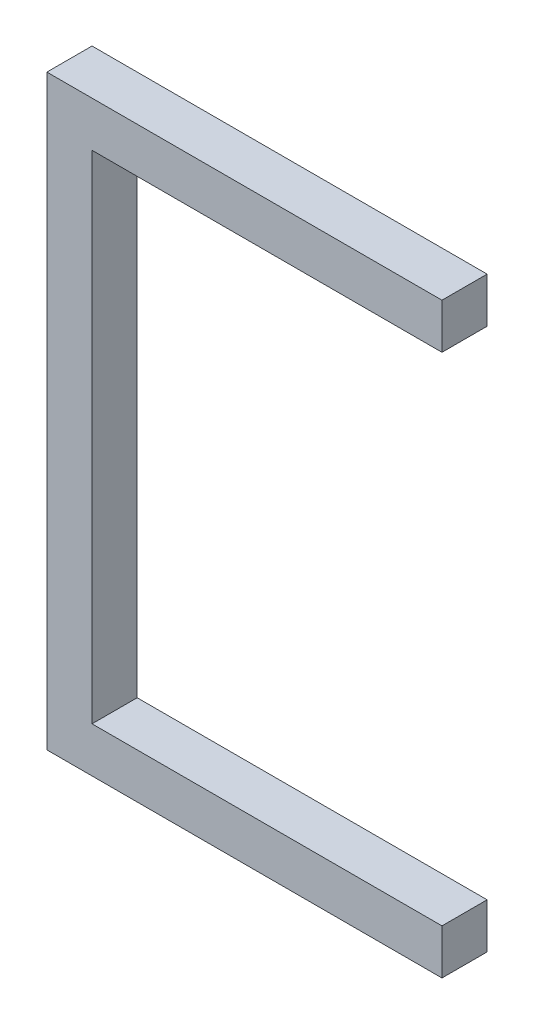
ISO-10303-21;
HEADER;
FILE_DESCRIPTION(('STEP AP214'),'2;1');
FILE_NAME('part.step','',(''),(''),'','','');
FILE_SCHEMA(('AUTOMOTIVE_DESIGN { 1 0 10303 214 1 1 1 1 }'));
ENDSEC;
DATA;
#1=APPLICATION_CONTEXT('core data for automotive mechanical design processes');
#2=APPLICATION_PROTOCOL_DEFINITION('international standard','automotive_design',2000,#1);
#3=PRODUCT_CONTEXT('',#1,'mechanical');
#4=PRODUCT('Part','Part','',(#3));
#5=PRODUCT_RELATED_PRODUCT_CATEGORY('part','',(#4));
#6=PRODUCT_DEFINITION_FORMATION('','',#4);
#7=PRODUCT_DEFINITION_CONTEXT('part definition',#1,'design');
#8=PRODUCT_DEFINITION('design','',#6,#7);
#9=PRODUCT_DEFINITION_SHAPE('','',#8);
#10=(LENGTH_UNIT() NAMED_UNIT(*) SI_UNIT(.MILLI.,.METRE.));
#11=(NAMED_UNIT(*) PLANE_ANGLE_UNIT() SI_UNIT($,.RADIAN.));
#12=(NAMED_UNIT(*) SI_UNIT($,.STERADIAN.) SOLID_ANGLE_UNIT());
#13=UNCERTAINTY_MEASURE_WITH_UNIT(LENGTH_MEASURE(1.E-05),#10,'distance_accuracy_value','');
#14=(GEOMETRIC_REPRESENTATION_CONTEXT(3) GLOBAL_UNCERTAINTY_ASSIGNED_CONTEXT((#13)) GLOBAL_UNIT_ASSIGNED_CONTEXT((#10,
#11,#12)) REPRESENTATION_CONTEXT('',''));
#15=CARTESIAN_POINT('',(0.,0.,0.));
#16=DIRECTION('',(0.,0.,1.));
#17=DIRECTION('',(1.,0.,0.));
#18=AXIS2_PLACEMENT_3D('',#15,#16,#17);
#19=CARTESIAN_POINT('',(18.0515620095641,363.949873220831,25.4));
#20=DIRECTION('',(-1.,0.,0.));
#21=DIRECTION('',(0.,-1.,0.));
#22=AXIS2_PLACEMENT_3D('',#19,#20,#21);
#23=PLANE('',#22);
#24=DIRECTION('',(0.,1.,0.));
#25=VECTOR('',#24,1.);
#26=CARTESIAN_POINT('',(18.0515620095641,363.949873220831,0.));
#27=LINE('',#26,#25);
#28=CARTESIAN_POINT('',(18.0515620095641,338.549873220831,0.));
#29=VERTEX_POINT('',#28);
#30=CARTESIAN_POINT('',(18.0515620095641,363.949873220831,0.));
#31=VERTEX_POINT('',#30);
#32=EDGE_CURVE('E129',#29,#31,#27,.T.);
#33=ORIENTED_EDGE('',*,*,#32,.T.);
#34=DIRECTION('',(0.,0.,-1.));
#35=VECTOR('',#34,1.);
#36=CARTESIAN_POINT('',(18.0515620095641,363.949873220831,25.4));
#37=LINE('',#36,#35);
#38=CARTESIAN_POINT('',(18.0515620095641,363.949873220831,25.4));
#39=VERTEX_POINT('',#38);
#40=EDGE_CURVE('E11',#39,#31,#37,.T.);
#41=ORIENTED_EDGE('',*,*,#40,.F.);
#42=DIRECTION('',(0.,1.,0.));
#43=VECTOR('',#42,1.);
#44=CARTESIAN_POINT('',(18.0515620095641,363.949873220831,25.4));
#45=LINE('',#44,#43);
#46=CARTESIAN_POINT('',(18.0515620095641,338.549873220831,25.4));
#47=VERTEX_POINT('',#46);
#48=EDGE_CURVE('E143',#47,#39,#45,.T.);
#49=ORIENTED_EDGE('',*,*,#48,.F.);
#50=DIRECTION('',(0.,0.,-1.));
#51=VECTOR('',#50,1.);
#52=CARTESIAN_POINT('',(18.0515620095641,338.549873220831,25.4));
#53=LINE('',#52,#51);
#54=EDGE_CURVE('E125',#47,#29,#53,.T.);
#55=ORIENTED_EDGE('',*,*,#54,.T.);
#56=EDGE_LOOP('',(#33,#41,#49,#55));
#57=FACE_BOUND('',#56,.T.);
#58=ADVANCED_FACE('F33',(#57),#23,.F.);
#59=CARTESIAN_POINT('',(-178.798437990436,363.949873220831,25.4));
#60=DIRECTION('',(0.,-1.,0.));
#61=DIRECTION('',(1.,0.,0.));
#62=AXIS2_PLACEMENT_3D('',#59,#60,#61);
#63=PLANE('',#62);
#64=DIRECTION('',(-1.,0.,0.));
#65=VECTOR('',#64,1.);
#66=CARTESIAN_POINT('',(-178.798437990436,363.949873220831,0.));
#67=LINE('',#66,#65);
#68=CARTESIAN_POINT('',(-178.798437990436,363.949873220831,0.));
#69=VERTEX_POINT('',#68);
#70=EDGE_CURVE('E132',#31,#69,#67,.T.);
#71=ORIENTED_EDGE('',*,*,#70,.T.);
#72=DIRECTION('',(0.,0.,-1.));
#73=VECTOR('',#72,1.);
#74=CARTESIAN_POINT('',(-178.798437990436,363.949873220831,25.4));
#75=LINE('',#74,#73);
#76=CARTESIAN_POINT('',(-178.798437990436,363.949873220831,25.4));
#77=VERTEX_POINT('',#76);
#78=EDGE_CURVE('E41',#77,#69,#75,.T.);
#79=ORIENTED_EDGE('',*,*,#78,.F.);
#80=DIRECTION('',(-1.,0.,0.));
#81=VECTOR('',#80,1.);
#82=CARTESIAN_POINT('',(-178.798437990436,363.949873220831,25.4));
#83=LINE('',#82,#81);
#84=EDGE_CURVE('E92',#39,#77,#83,.T.);
#85=ORIENTED_EDGE('',*,*,#84,.F.);
#86=ORIENTED_EDGE('',*,*,#40,.T.);
#87=EDGE_LOOP('',(#71,#79,#85,#86));
#88=FACE_BOUND('',#87,.T.);
#89=ADVANCED_FACE('F178',(#88),#63,.F.);
#90=CARTESIAN_POINT('',(-178.798437990436,643.349873220831,25.4));
#91=DIRECTION('',(-1.,0.,0.));
#92=DIRECTION('',(0.,-1.,0.));
#93=AXIS2_PLACEMENT_3D('',#90,#91,#92);
#94=PLANE('',#93);
#95=DIRECTION('',(0.,1.,0.));
#96=VECTOR('',#95,1.);
#97=CARTESIAN_POINT('',(-178.798437990436,643.349873220831,0.));
#98=LINE('',#97,#96);
#99=CARTESIAN_POINT('',(-178.798437990436,643.349873220831,0.));
#100=VERTEX_POINT('',#99);
#101=EDGE_CURVE('E134',#69,#100,#98,.T.);
#102=ORIENTED_EDGE('',*,*,#101,.T.);
#103=DIRECTION('',(0.,0.,-1.));
#104=VECTOR('',#103,1.);
#105=CARTESIAN_POINT('',(-178.798437990436,643.349873220831,25.4));
#106=LINE('',#105,#104);
#107=CARTESIAN_POINT('',(-178.798437990436,643.349873220831,25.4));
#108=VERTEX_POINT('',#107);
#109=EDGE_CURVE('E150',#108,#100,#106,.T.);
#110=ORIENTED_EDGE('',*,*,#109,.F.);
#111=DIRECTION('',(0.,1.,0.));
#112=VECTOR('',#111,1.);
#113=CARTESIAN_POINT('',(-178.798437990436,643.349873220831,25.4));
#114=LINE('',#113,#112);
#115=EDGE_CURVE('E158',#77,#108,#114,.T.);
#116=ORIENTED_EDGE('',*,*,#115,.F.);
#117=ORIENTED_EDGE('',*,*,#78,.T.);
#118=EDGE_LOOP('',(#102,#110,#116,#117));
#119=FACE_BOUND('',#118,.T.);
#120=ADVANCED_FACE('F156',(#119),#94,.F.);
#121=CARTESIAN_POINT('',(18.0515620095641,643.349873220831,25.4));
#122=DIRECTION('',(0.,1.,0.));
#123=DIRECTION('',(0.,0.,1.));
#124=AXIS2_PLACEMENT_3D('',#121,#122,#123);
#125=PLANE('',#124);
#126=DIRECTION('',(1.,0.,0.));
#127=VECTOR('',#126,1.);
#128=CARTESIAN_POINT('',(18.0515620095641,643.349873220831,0.));
#129=LINE('',#128,#127);
#130=CARTESIAN_POINT('',(18.0515620095641,643.349873220831,0.));
#131=VERTEX_POINT('',#130);
#132=EDGE_CURVE('E136',#100,#131,#129,.T.);
#133=ORIENTED_EDGE('',*,*,#132,.T.);
#134=DIRECTION('',(0.,0.,-1.));
#135=VECTOR('',#134,1.);
#136=CARTESIAN_POINT('',(18.0515620095641,643.349873220831,25.4));
#137=LINE('',#136,#135);
#138=CARTESIAN_POINT('',(18.0515620095641,643.349873220831,25.4));
#139=VERTEX_POINT('',#138);
#140=EDGE_CURVE('E147',#139,#131,#137,.T.);
#141=ORIENTED_EDGE('',*,*,#140,.F.);
#142=DIRECTION('',(1.,0.,0.));
#143=VECTOR('',#142,1.);
#144=CARTESIAN_POINT('',(18.0515620095641,643.349873220831,25.4));
#145=LINE('',#144,#143);
#146=EDGE_CURVE('E170',#108,#139,#145,.T.);
#147=ORIENTED_EDGE('',*,*,#146,.F.);
#148=ORIENTED_EDGE('',*,*,#109,.T.);
#149=EDGE_LOOP('',(#133,#141,#147,#148));
#150=FACE_BOUND('',#149,.T.);
#151=ADVANCED_FACE('F166',(#150),#125,.F.);
#152=CARTESIAN_POINT('',(18.0515620095641,668.749873220831,25.4));
#153=DIRECTION('',(-1.,0.,0.));
#154=DIRECTION('',(0.,0.,1.));
#155=AXIS2_PLACEMENT_3D('',#152,#153,#154);
#156=PLANE('',#155);
#157=DIRECTION('',(0.,1.,0.));
#158=VECTOR('',#157,1.);
#159=CARTESIAN_POINT('',(18.0515620095641,668.749873220831,0.));
#160=LINE('',#159,#158);
#161=CARTESIAN_POINT('',(18.0515620095641,668.749873220831,0.));
#162=VERTEX_POINT('',#161);
#163=EDGE_CURVE('E138',#131,#162,#160,.T.);
#164=ORIENTED_EDGE('',*,*,#163,.T.);
#165=DIRECTION('',(0.,0.,-1.));
#166=VECTOR('',#165,1.);
#167=CARTESIAN_POINT('',(18.0515620095641,668.749873220831,25.4));
#168=LINE('',#167,#166);
#169=CARTESIAN_POINT('',(18.0515620095641,668.749873220831,25.4));
#170=VERTEX_POINT('',#169);
#171=EDGE_CURVE('E120',#170,#162,#168,.T.);
#172=ORIENTED_EDGE('',*,*,#171,.F.);
#173=DIRECTION('',(0.,1.,0.));
#174=VECTOR('',#173,1.);
#175=CARTESIAN_POINT('',(18.0515620095641,668.749873220831,25.4));
#176=LINE('',#175,#174);
#177=EDGE_CURVE('E111',#139,#170,#176,.T.);
#178=ORIENTED_EDGE('',*,*,#177,.F.);
#179=ORIENTED_EDGE('',*,*,#140,.T.);
#180=EDGE_LOOP('',(#164,#172,#178,#179));
#181=FACE_BOUND('',#180,.T.);
#182=ADVANCED_FACE('F169',(#181),#156,.F.);
#183=CARTESIAN_POINT('',(-204.198437990436,668.749873220831,25.4));
#184=DIRECTION('',(0.,-1.,0.));
#185=DIRECTION('',(0.,0.,-1.));
#186=AXIS2_PLACEMENT_3D('',#183,#184,#185);
#187=PLANE('',#186);
#188=DIRECTION('',(-1.,0.,0.));
#189=VECTOR('',#188,1.);
#190=CARTESIAN_POINT('',(-204.198437990436,668.749873220831,0.));
#191=LINE('',#190,#189);
#192=CARTESIAN_POINT('',(-204.198437990436,668.749873220831,0.));
#193=VERTEX_POINT('',#192);
#194=EDGE_CURVE('E119',#162,#193,#191,.T.);
#195=ORIENTED_EDGE('',*,*,#194,.T.);
#196=DIRECTION('',(0.,0.,-1.));
#197=VECTOR('',#196,1.);
#198=CARTESIAN_POINT('',(-204.198437990436,668.749873220831,25.4));
#199=LINE('',#198,#197);
#200=CARTESIAN_POINT('',(-204.198437990436,668.749873220831,25.4));
#201=VERTEX_POINT('',#200);
#202=EDGE_CURVE('E116',#201,#193,#199,.T.);
#203=ORIENTED_EDGE('',*,*,#202,.F.);
#204=DIRECTION('',(-1.,0.,0.));
#205=VECTOR('',#204,1.);
#206=CARTESIAN_POINT('',(-204.198437990436,668.749873220831,25.4));
#207=LINE('',#206,#205);
#208=EDGE_CURVE('E105',#170,#201,#207,.T.);
#209=ORIENTED_EDGE('',*,*,#208,.F.);
#210=ORIENTED_EDGE('',*,*,#171,.T.);
#211=EDGE_LOOP('',(#195,#203,#209,#210));
#212=FACE_BOUND('',#211,.T.);
#213=ADVANCED_FACE('F117',(#212),#187,.F.);
#214=CARTESIAN_POINT('',(-204.198437990436,338.549873220831,25.4));
#215=DIRECTION('',(1.,0.,0.));
#216=DIRECTION('',(0.,0.,-1.));
#217=AXIS2_PLACEMENT_3D('',#214,#215,#216);
#218=PLANE('',#217);
#219=DIRECTION('',(0.,-1.,0.));
#220=VECTOR('',#219,1.);
#221=CARTESIAN_POINT('',(-204.198437990436,338.549873220831,0.));
#222=LINE('',#221,#220);
#223=CARTESIAN_POINT('',(-204.198437990436,338.549873220831,0.));
#224=VERTEX_POINT('',#223);
#225=EDGE_CURVE('E78',#193,#224,#222,.T.);
#226=ORIENTED_EDGE('',*,*,#225,.T.);
#227=DIRECTION('',(0.,0.,-1.));
#228=VECTOR('',#227,1.);
#229=CARTESIAN_POINT('',(-204.198437990436,338.549873220831,25.4));
#230=LINE('',#229,#228);
#231=CARTESIAN_POINT('',(-204.198437990436,338.549873220831,25.4));
#232=VERTEX_POINT('',#231);
#233=EDGE_CURVE('E121',#232,#224,#230,.T.);
#234=ORIENTED_EDGE('',*,*,#233,.F.);
#235=DIRECTION('',(0.,-1.,0.));
#236=VECTOR('',#235,1.);
#237=CARTESIAN_POINT('',(-204.198437990436,338.549873220831,25.4));
#238=LINE('',#237,#236);
#239=EDGE_CURVE('E109',#201,#232,#238,.T.);
#240=ORIENTED_EDGE('',*,*,#239,.F.);
#241=ORIENTED_EDGE('',*,*,#202,.T.);
#242=EDGE_LOOP('',(#226,#234,#240,#241));
#243=FACE_BOUND('',#242,.T.);
#244=ADVANCED_FACE('F123',(#243),#218,.F.);
#245=CARTESIAN_POINT('',(18.0515620095641,338.549873220831,25.4));
#246=DIRECTION('',(0.,1.,0.));
#247=DIRECTION('',(0.,0.,1.));
#248=AXIS2_PLACEMENT_3D('',#245,#246,#247);
#249=PLANE('',#248);
#250=DIRECTION('',(1.,0.,0.));
#251=VECTOR('',#250,1.);
#252=CARTESIAN_POINT('',(18.0515620095641,338.549873220831,0.));
#253=LINE('',#252,#251);
#254=EDGE_CURVE('E84',#224,#29,#253,.T.);
#255=ORIENTED_EDGE('',*,*,#254,.T.);
#256=ORIENTED_EDGE('',*,*,#54,.F.);
#257=DIRECTION('',(1.,0.,0.));
#258=VECTOR('',#257,1.);
#259=CARTESIAN_POINT('',(18.0515620095641,338.549873220831,25.4));
#260=LINE('',#259,#258);
#261=EDGE_CURVE('E49',#232,#47,#260,.T.);
#262=ORIENTED_EDGE('',*,*,#261,.F.);
#263=ORIENTED_EDGE('',*,*,#233,.T.);
#264=EDGE_LOOP('',(#255,#256,#262,#263));
#265=FACE_BOUND('',#264,.T.);
#266=ADVANCED_FACE('F194',(#265),#249,.F.);
#267=CARTESIAN_POINT('',(0.,0.,25.4));
#268=DIRECTION('',(0.,0.,-1.));
#269=DIRECTION('',(-1.,0.,0.));
#270=AXIS2_PLACEMENT_3D('',#267,#268,#269);
#271=PLANE('',#270);
#272=ORIENTED_EDGE('',*,*,#48,.T.);
#273=ORIENTED_EDGE('',*,*,#84,.T.);
#274=ORIENTED_EDGE('',*,*,#115,.T.);
#275=ORIENTED_EDGE('',*,*,#146,.T.);
#276=ORIENTED_EDGE('',*,*,#177,.T.);
#277=ORIENTED_EDGE('',*,*,#208,.T.);
#278=ORIENTED_EDGE('',*,*,#239,.T.);
#279=ORIENTED_EDGE('',*,*,#261,.T.);
#280=EDGE_LOOP('',(#272,#273,#274,#275,#276,#277,#278,#279));
#281=FACE_BOUND('',#280,.T.);
#282=ADVANCED_FACE('F107',(#281),#271,.F.);
#283=CARTESIAN_POINT('',(0.,0.,0.));
#284=DIRECTION('',(0.,0.,-1.));
#285=DIRECTION('',(-1.,0.,0.));
#286=AXIS2_PLACEMENT_3D('',#283,#284,#285);
#287=PLANE('',#286);
#288=ORIENTED_EDGE('',*,*,#32,.F.);
#289=ORIENTED_EDGE('',*,*,#254,.F.);
#290=ORIENTED_EDGE('',*,*,#225,.F.);
#291=ORIENTED_EDGE('',*,*,#194,.F.);
#292=ORIENTED_EDGE('',*,*,#163,.F.);
#293=ORIENTED_EDGE('',*,*,#132,.F.);
#294=ORIENTED_EDGE('',*,*,#101,.F.);
#295=ORIENTED_EDGE('',*,*,#70,.F.);
#296=EDGE_LOOP('',(#288,#289,#290,#291,#292,#293,#294,#295));
#297=FACE_BOUND('',#296,.T.);
#298=ADVANCED_FACE('F162',(#297),#287,.T.);
#299=CLOSED_SHELL('',(#58,#89,#120,#151,#182,#213,#244,#266,#282,#298));
#300=MANIFOLD_SOLID_BREP('B2',#299);
#301=ADVANCED_BREP_SHAPE_REPRESENTATION('',(#18,#300),#14);
#302=SHAPE_DEFINITION_REPRESENTATION(#9,#301);
ENDSEC;
END-ISO-10303-21;
